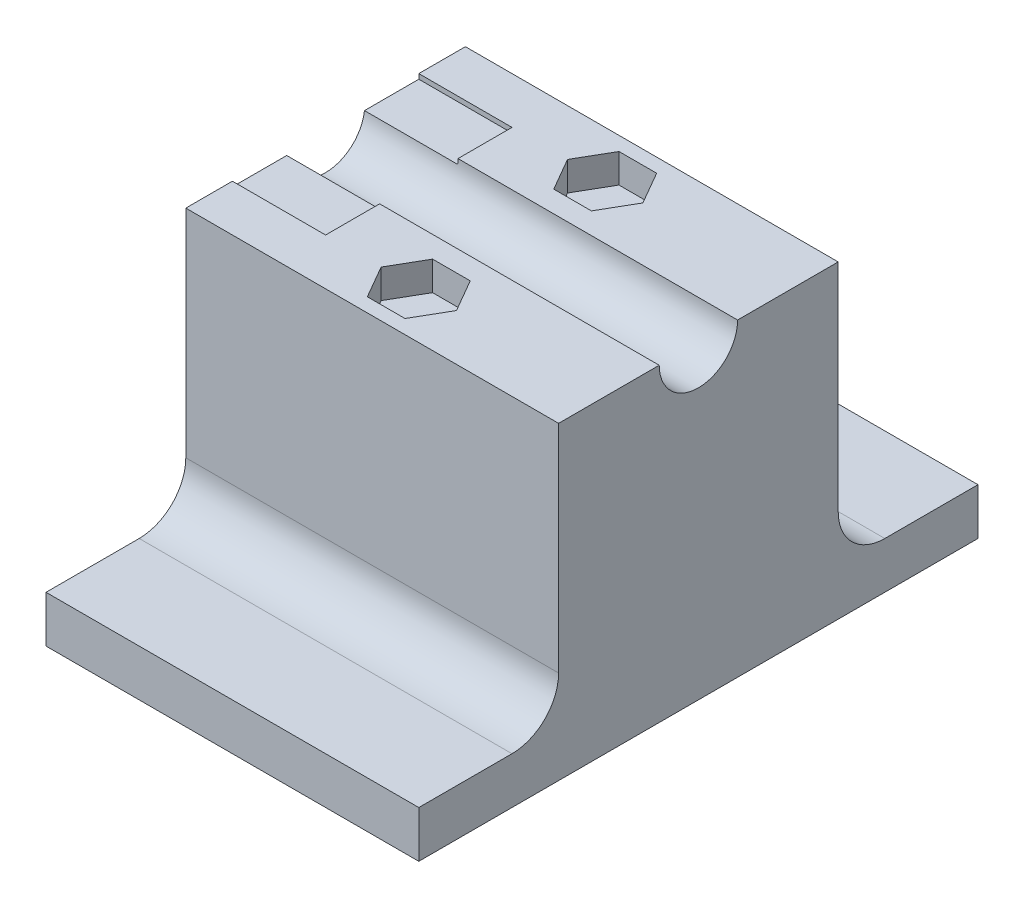
ISO-10303-21;
HEADER;
FILE_DESCRIPTION(('STEP AP214'),'2;1');
FILE_NAME('part.step','',(''),(''),'','','');
FILE_SCHEMA(('AUTOMOTIVE_DESIGN { 1 0 10303 214 1 1 1 1 }'));
ENDSEC;
DATA;
#1=APPLICATION_CONTEXT('core data for automotive mechanical design processes');
#2=APPLICATION_PROTOCOL_DEFINITION('international standard','automotive_design',2000,#1);
#3=PRODUCT_CONTEXT('',#1,'mechanical');
#4=PRODUCT('Part','Part','',(#3));
#5=PRODUCT_RELATED_PRODUCT_CATEGORY('part','',(#4));
#6=PRODUCT_DEFINITION_FORMATION('','',#4);
#7=PRODUCT_DEFINITION_CONTEXT('part definition',#1,'design');
#8=PRODUCT_DEFINITION('design','',#6,#7);
#9=PRODUCT_DEFINITION_SHAPE('','',#8);
#10=(LENGTH_UNIT() NAMED_UNIT(*) SI_UNIT(.MILLI.,.METRE.));
#11=(NAMED_UNIT(*) PLANE_ANGLE_UNIT() SI_UNIT($,.RADIAN.));
#12=(NAMED_UNIT(*) SI_UNIT($,.STERADIAN.) SOLID_ANGLE_UNIT());
#13=UNCERTAINTY_MEASURE_WITH_UNIT(LENGTH_MEASURE(1.E-05),#10,'distance_accuracy_value','');
#14=(GEOMETRIC_REPRESENTATION_CONTEXT(3) GLOBAL_UNCERTAINTY_ASSIGNED_CONTEXT((#13)) GLOBAL_UNIT_ASSIGNED_CONTEXT((#10,
#11,#12)) REPRESENTATION_CONTEXT('',''));
#15=CARTESIAN_POINT('',(0.,0.,0.));
#16=DIRECTION('',(0.,0.,1.));
#17=DIRECTION('',(1.,0.,0.));
#18=AXIS2_PLACEMENT_3D('',#15,#16,#17);
#19=CARTESIAN_POINT('',(0.,33.2,0.));
#20=DIRECTION('',(0.,-1.,0.));
#21=DIRECTION('',(0.,0.,-1.));
#22=AXIS2_PLACEMENT_3D('',#19,#20,#21);
#23=PLANE('',#22);
#24=DIRECTION('',(0.,0.,-1.));
#25=VECTOR('',#24,1.);
#26=CARTESIAN_POINT('',(-10.,33.2,0.));
#27=LINE('',#26,#25);
#28=CARTESIAN_POINT('',(-10.,33.2,9.99999999999993));
#29=VERTEX_POINT('',#28);
#30=CARTESIAN_POINT('',(-10.,33.2,4.205));
#31=VERTEX_POINT('',#30);
#32=EDGE_CURVE('E62',#29,#31,#27,.T.);
#33=ORIENTED_EDGE('',*,*,#32,.F.);
#34=DIRECTION('',(-1.,0.,0.));
#35=VECTOR('',#34,1.);
#36=CARTESIAN_POINT('',(0.,33.2,9.99999999999993));
#37=LINE('',#36,#35);
#38=CARTESIAN_POINT('',(-20.,33.2,9.99999999999993));
#39=VERTEX_POINT('',#38);
#40=EDGE_CURVE('E269',#29,#39,#37,.T.);
#41=ORIENTED_EDGE('',*,*,#40,.T.);
#42=DIRECTION('',(0.,0.,1.));
#43=VECTOR('',#42,1.);
#44=CARTESIAN_POINT('',(-20.,33.2,15.));
#45=LINE('',#44,#43);
#46=CARTESIAN_POINT('',(-20.,33.2,15.));
#47=VERTEX_POINT('',#46);
#48=EDGE_CURVE('E406',#39,#47,#45,.T.);
#49=ORIENTED_EDGE('',*,*,#48,.T.);
#50=DIRECTION('',(1.,0.,0.));
#51=VECTOR('',#50,1.);
#52=CARTESIAN_POINT('',(-20.,33.2,15.));
#53=LINE('',#52,#51);
#54=CARTESIAN_POINT('',(20.,33.2,15.));
#55=VERTEX_POINT('',#54);
#56=EDGE_CURVE('E405',#47,#55,#53,.T.);
#57=ORIENTED_EDGE('',*,*,#56,.T.);
#58=DIRECTION('',(0.,0.,-1.));
#59=VECTOR('',#58,1.);
#60=CARTESIAN_POINT('',(20.,33.2,15.));
#61=LINE('',#60,#59);
#62=CARTESIAN_POINT('',(20.,33.2,4.205));
#63=VERTEX_POINT('',#62);
#64=EDGE_CURVE('E409',#55,#63,#61,.T.);
#65=ORIENTED_EDGE('',*,*,#64,.T.);
#66=DIRECTION('',(-1.,0.,0.));
#67=VECTOR('',#66,1.);
#68=CARTESIAN_POINT('',(20.,33.2,4.205));
#69=LINE('',#68,#67);
#70=EDGE_CURVE('E431',#63,#31,#69,.T.);
#71=ORIENTED_EDGE('',*,*,#70,.T.);
#72=EDGE_LOOP('',(#33,#41,#49,#57,#65,#71));
#73=FACE_BOUND('',#72,.T.);
#74=DIRECTION('',(1.,0.,0.));
#75=VECTOR('',#74,1.);
#76=CARTESIAN_POINT('',(-2.02072594216369,33.2,6.5));
#77=LINE('',#76,#75);
#78=CARTESIAN_POINT('',(-2.02072594216369,33.2,6.5));
#79=VERTEX_POINT('',#78);
#80=CARTESIAN_POINT('',(2.02072594216369,33.2,6.5));
#81=VERTEX_POINT('',#80);
#82=EDGE_CURVE('E283',#79,#81,#77,.T.);
#83=ORIENTED_EDGE('',*,*,#82,.T.);
#84=DIRECTION('',(0.5,0.,0.866025403784439));
#85=VECTOR('',#84,1.);
#86=CARTESIAN_POINT('',(2.02072594216369,33.2,6.5));
#87=LINE('',#86,#85);
#88=CARTESIAN_POINT('',(4.04145188432738,33.2,10.));
#89=VERTEX_POINT('',#88);
#90=EDGE_CURVE('E307',#81,#89,#87,.T.);
#91=ORIENTED_EDGE('',*,*,#90,.T.);
#92=DIRECTION('',(-0.5,0.,0.866025403784439));
#93=VECTOR('',#92,1.);
#94=CARTESIAN_POINT('',(4.04145188432738,33.2,10.));
#95=LINE('',#94,#93);
#96=CARTESIAN_POINT('',(2.02072594216369,33.2,13.5));
#97=VERTEX_POINT('',#96);
#98=EDGE_CURVE('E329',#89,#97,#95,.T.);
#99=ORIENTED_EDGE('',*,*,#98,.T.);
#100=DIRECTION('',(-1.,0.,0.));
#101=VECTOR('',#100,1.);
#102=CARTESIAN_POINT('',(2.02072594216369,33.2,13.5));
#103=LINE('',#102,#101);
#104=CARTESIAN_POINT('',(-2.02072594216369,33.2,13.5));
#105=VERTEX_POINT('',#104);
#106=EDGE_CURVE('E326',#97,#105,#103,.T.);
#107=ORIENTED_EDGE('',*,*,#106,.T.);
#108=DIRECTION('',(-0.5,0.,-0.866025403784439));
#109=VECTOR('',#108,1.);
#110=CARTESIAN_POINT('',(-2.02072594216369,33.2,13.5));
#111=LINE('',#110,#109);
#112=CARTESIAN_POINT('',(-4.04145188432738,33.2,10.));
#113=VERTEX_POINT('',#112);
#114=EDGE_CURVE('E323',#105,#113,#111,.T.);
#115=ORIENTED_EDGE('',*,*,#114,.T.);
#116=DIRECTION('',(0.5,0.,-0.866025403784439));
#117=VECTOR('',#116,1.);
#118=CARTESIAN_POINT('',(-4.04145188432738,33.2,10.));
#119=LINE('',#118,#117);
#120=EDGE_CURVE('E320',#113,#79,#119,.T.);
#121=ORIENTED_EDGE('',*,*,#120,.T.);
#122=EDGE_LOOP('',(#83,#91,#99,#107,#115,#121));
#123=FACE_BOUND('',#122,.T.);
#124=ADVANCED_FACE('F39',(#73,#123),#23,.F.);
#125=CARTESIAN_POINT('',(-20.,33.2,15.));
#126=DIRECTION('',(1.,0.,0.));
#127=DIRECTION('',(0.,0.,-1.));
#128=AXIS2_PLACEMENT_3D('',#125,#126,#127);
#129=PLANE('',#128);
#130=ORIENTED_EDGE('',*,*,#48,.F.);
#131=DIRECTION('',(0.,1.,0.));
#132=VECTOR('',#131,1.);
#133=CARTESIAN_POINT('',(-20.,33.725,9.99999999999993));
#134=LINE('',#133,#132);
#135=CARTESIAN_POINT('',(-20.,32.675,9.99999999999993));
#136=VERTEX_POINT('',#135);
#137=EDGE_CURVE('E259',#136,#39,#134,.T.);
#138=ORIENTED_EDGE('',*,*,#137,.F.);
#139=DIRECTION('',(0.,0.,1.));
#140=VECTOR('',#139,1.);
#141=CARTESIAN_POINT('',(-20.,32.675,-10.0000000000001));
#142=LINE('',#141,#140);
#143=CARTESIAN_POINT('',(-20.,32.675,4.17209779367646));
#144=VERTEX_POINT('',#143);
#145=EDGE_CURVE('E262',#144,#136,#142,.T.);
#146=ORIENTED_EDGE('',*,*,#145,.F.);
#147=CARTESIAN_POINT('',(-20.,33.2,0.));
#148=DIRECTION('',(-1.,0.,0.));
#149=DIRECTION('',(0.,0.,1.));
#150=AXIS2_PLACEMENT_3D('',#147,#148,#149);
#151=CIRCLE('',#150,4.205);
#152=CARTESIAN_POINT('',(-20.,32.675,-4.17209779367646));
#153=VERTEX_POINT('',#152);
#154=EDGE_CURVE('E385',#153,#144,#151,.T.);
#155=ORIENTED_EDGE('',*,*,#154,.F.);
#156=CARTESIAN_POINT('',(-20.,32.675,-10.0000000000001));
#157=VERTEX_POINT('',#156);
#158=EDGE_CURVE('E263',#157,#153,#142,.T.);
#159=ORIENTED_EDGE('',*,*,#158,.F.);
#160=DIRECTION('',(0.,-1.,0.));
#161=VECTOR('',#160,1.);
#162=CARTESIAN_POINT('',(-20.,33.725,-10.0000000000001));
#163=LINE('',#162,#161);
#164=CARTESIAN_POINT('',(-20.,33.2,-10.0000000000001));
#165=VERTEX_POINT('',#164);
#166=EDGE_CURVE('E248',#165,#157,#163,.T.);
#167=ORIENTED_EDGE('',*,*,#166,.F.);
#168=CARTESIAN_POINT('',(-20.,33.2,-15.));
#169=VERTEX_POINT('',#168);
#170=EDGE_CURVE('E402',#169,#165,#45,.T.);
#171=ORIENTED_EDGE('',*,*,#170,.F.);
#172=DIRECTION('',(0.,-1.,0.));
#173=VECTOR('',#172,1.);
#174=CARTESIAN_POINT('',(-20.,33.2,-15.));
#175=LINE('',#174,#173);
#176=CARTESIAN_POINT('',(-20.,10.,-15.));
#177=VERTEX_POINT('',#176);
#178=EDGE_CURVE('E414',#169,#177,#175,.T.);
#179=ORIENTED_EDGE('',*,*,#178,.T.);
#180=CARTESIAN_POINT('',(-20.,10.,-20.));
#181=DIRECTION('',(1.,0.,0.));
#182=DIRECTION('',(0.,0.,-1.));
#183=AXIS2_PLACEMENT_3D('',#180,#181,#182);
#184=CIRCLE('',#183,5.);
#185=CARTESIAN_POINT('',(-20.,5.00000000000001,-20.));
#186=VERTEX_POINT('',#185);
#187=EDGE_CURVE('E444',#177,#186,#184,.T.);
#188=ORIENTED_EDGE('',*,*,#187,.T.);
#189=DIRECTION('',(0.,0.,-1.));
#190=VECTOR('',#189,1.);
#191=CARTESIAN_POINT('',(-20.,5.,30.));
#192=LINE('',#191,#190);
#193=CARTESIAN_POINT('',(-20.,5.00000000000001,-30.));
#194=VERTEX_POINT('',#193);
#195=EDGE_CURVE('E276',#186,#194,#192,.T.);
#196=ORIENTED_EDGE('',*,*,#195,.T.);
#197=DIRECTION('',(0.,-1.,0.));
#198=VECTOR('',#197,1.);
#199=CARTESIAN_POINT('',(-20.,0.,-30.));
#200=LINE('',#199,#198);
#201=CARTESIAN_POINT('',(-20.,0.,-30.));
#202=VERTEX_POINT('',#201);
#203=EDGE_CURVE('E273',#194,#202,#200,.T.);
#204=ORIENTED_EDGE('',*,*,#203,.T.);
#205=DIRECTION('',(0.,0.,1.));
#206=VECTOR('',#205,1.);
#207=CARTESIAN_POINT('',(-20.,0.,15.));
#208=LINE('',#207,#206);
#209=CARTESIAN_POINT('',(-20.,0.,30.));
#210=VERTEX_POINT('',#209);
#211=EDGE_CURVE('E399',#202,#210,#208,.T.);
#212=ORIENTED_EDGE('',*,*,#211,.T.);
#213=DIRECTION('',(0.,1.,0.));
#214=VECTOR('',#213,1.);
#215=CARTESIAN_POINT('',(-20.,0.,30.));
#216=LINE('',#215,#214);
#217=CARTESIAN_POINT('',(-20.,5.,30.));
#218=VERTEX_POINT('',#217);
#219=EDGE_CURVE('E281',#210,#218,#216,.T.);
#220=ORIENTED_EDGE('',*,*,#219,.T.);
#221=CARTESIAN_POINT('',(-20.,5.,20.));
#222=VERTEX_POINT('',#221);
#223=EDGE_CURVE('E278',#218,#222,#192,.T.);
#224=ORIENTED_EDGE('',*,*,#223,.T.);
#225=CARTESIAN_POINT('',(-20.,10.,20.));
#226=DIRECTION('',(1.,0.,0.));
#227=DIRECTION('',(0.,0.,-1.));
#228=AXIS2_PLACEMENT_3D('',#225,#226,#227);
#229=CIRCLE('',#228,5.);
#230=CARTESIAN_POINT('',(-20.,10.,15.));
#231=VERTEX_POINT('',#230);
#232=EDGE_CURVE('E450',#222,#231,#229,.T.);
#233=ORIENTED_EDGE('',*,*,#232,.T.);
#234=DIRECTION('',(0.,-1.,0.));
#235=VECTOR('',#234,1.);
#236=CARTESIAN_POINT('',(-20.,33.2,15.));
#237=LINE('',#236,#235);
#238=EDGE_CURVE('E426',#47,#231,#237,.T.);
#239=ORIENTED_EDGE('',*,*,#238,.F.);
#240=EDGE_LOOP('',(#130,#138,#146,#155,#159,#167,#171,#179,#188,#196,#204,#212,#220,#224,#233,#239));
#241=FACE_BOUND('',#240,.T.);
#242=ADVANCED_FACE('F477',(#241),#129,.F.);
#243=CARTESIAN_POINT('',(-20.,33.2,15.));
#244=DIRECTION('',(0.,0.,-1.));
#245=DIRECTION('',(-1.,0.,0.));
#246=AXIS2_PLACEMENT_3D('',#243,#244,#245);
#247=PLANE('',#246);
#248=ORIENTED_EDGE('',*,*,#238,.T.);
#249=DIRECTION('',(1.,0.,0.));
#250=VECTOR('',#249,1.);
#251=CARTESIAN_POINT('',(-20.,10.,15.));
#252=LINE('',#251,#250);
#253=CARTESIAN_POINT('',(20.,10.,15.));
#254=VERTEX_POINT('',#253);
#255=EDGE_CURVE('E439',#231,#254,#252,.T.);
#256=ORIENTED_EDGE('',*,*,#255,.T.);
#257=DIRECTION('',(0.,-1.,0.));
#258=VECTOR('',#257,1.);
#259=CARTESIAN_POINT('',(20.,33.2,15.));
#260=LINE('',#259,#258);
#261=EDGE_CURVE('E423',#55,#254,#260,.T.);
#262=ORIENTED_EDGE('',*,*,#261,.F.);
#263=ORIENTED_EDGE('',*,*,#56,.F.);
#264=EDGE_LOOP('',(#248,#256,#262,#263));
#265=FACE_BOUND('',#264,.T.);
#266=ADVANCED_FACE('F493',(#265),#247,.F.);
#267=CARTESIAN_POINT('',(20.,33.2,15.));
#268=DIRECTION('',(-1.,0.,0.));
#269=DIRECTION('',(0.,0.,1.));
#270=AXIS2_PLACEMENT_3D('',#267,#268,#269);
#271=PLANE('',#270);
#272=ORIENTED_EDGE('',*,*,#261,.T.);
#273=CARTESIAN_POINT('',(20.,10.,20.));
#274=DIRECTION('',(-1.,0.,0.));
#275=DIRECTION('',(0.,0.,1.));
#276=AXIS2_PLACEMENT_3D('',#273,#274,#275);
#277=CIRCLE('',#276,5.);
#278=CARTESIAN_POINT('',(20.,5.,20.));
#279=VERTEX_POINT('',#278);
#280=EDGE_CURVE('E448',#254,#279,#277,.T.);
#281=ORIENTED_EDGE('',*,*,#280,.T.);
#282=DIRECTION('',(0.,0.,1.));
#283=VECTOR('',#282,1.);
#284=CARTESIAN_POINT('',(20.,5.,30.));
#285=LINE('',#284,#283);
#286=CARTESIAN_POINT('',(20.,5.,30.));
#287=VERTEX_POINT('',#286);
#288=EDGE_CURVE('E289',#279,#287,#285,.T.);
#289=ORIENTED_EDGE('',*,*,#288,.T.);
#290=DIRECTION('',(0.,-1.,0.));
#291=VECTOR('',#290,1.);
#292=CARTESIAN_POINT('',(20.,0.,30.));
#293=LINE('',#292,#291);
#294=CARTESIAN_POINT('',(20.,0.,30.));
#295=VERTEX_POINT('',#294);
#296=EDGE_CURVE('E272',#287,#295,#293,.T.);
#297=ORIENTED_EDGE('',*,*,#296,.T.);
#298=DIRECTION('',(0.,0.,-1.));
#299=VECTOR('',#298,1.);
#300=CARTESIAN_POINT('',(20.,0.,15.));
#301=LINE('',#300,#299);
#302=CARTESIAN_POINT('',(20.,0.,-30.));
#303=VERTEX_POINT('',#302);
#304=EDGE_CURVE('E416',#295,#303,#301,.T.);
#305=ORIENTED_EDGE('',*,*,#304,.T.);
#306=DIRECTION('',(0.,1.,0.));
#307=VECTOR('',#306,1.);
#308=CARTESIAN_POINT('',(20.,0.,-30.));
#309=LINE('',#308,#307);
#310=CARTESIAN_POINT('',(20.,5.00000000000001,-30.));
#311=VERTEX_POINT('',#310);
#312=EDGE_CURVE('E286',#303,#311,#309,.T.);
#313=ORIENTED_EDGE('',*,*,#312,.T.);
#314=CARTESIAN_POINT('',(20.,5.00000000000001,-20.));
#315=VERTEX_POINT('',#314);
#316=EDGE_CURVE('E290',#311,#315,#285,.T.);
#317=ORIENTED_EDGE('',*,*,#316,.T.);
#318=CARTESIAN_POINT('',(20.,10.,-20.));
#319=DIRECTION('',(-1.,0.,0.));
#320=DIRECTION('',(0.,0.,1.));
#321=AXIS2_PLACEMENT_3D('',#318,#319,#320);
#322=CIRCLE('',#321,5.);
#323=CARTESIAN_POINT('',(20.,10.,-15.));
#324=VERTEX_POINT('',#323);
#325=EDGE_CURVE('E446',#315,#324,#322,.T.);
#326=ORIENTED_EDGE('',*,*,#325,.T.);
#327=DIRECTION('',(0.,-1.,0.));
#328=VECTOR('',#327,1.);
#329=CARTESIAN_POINT('',(20.,33.2,-15.));
#330=LINE('',#329,#328);
#331=CARTESIAN_POINT('',(20.,33.2,-15.));
#332=VERTEX_POINT('',#331);
#333=EDGE_CURVE('E420',#332,#324,#330,.T.);
#334=ORIENTED_EDGE('',*,*,#333,.F.);
#335=CARTESIAN_POINT('',(20.,33.2,-4.205));
#336=VERTEX_POINT('',#335);
#337=EDGE_CURVE('E408',#336,#332,#61,.T.);
#338=ORIENTED_EDGE('',*,*,#337,.F.);
#339=CARTESIAN_POINT('',(20.,33.2,0.));
#340=DIRECTION('',(-1.,0.,0.));
#341=DIRECTION('',(0.,0.,1.));
#342=AXIS2_PLACEMENT_3D('',#339,#340,#341);
#343=CIRCLE('',#342,4.205);
#344=EDGE_CURVE('E396',#336,#63,#343,.T.);
#345=ORIENTED_EDGE('',*,*,#344,.T.);
#346=ORIENTED_EDGE('',*,*,#64,.F.);
#347=EDGE_LOOP('',(#272,#281,#289,#297,#305,#313,#317,#326,#334,#338,#345,#346));
#348=FACE_BOUND('',#347,.T.);
#349=ADVANCED_FACE('F468',(#348),#271,.F.);
#350=CARTESIAN_POINT('',(-20.,33.2,-15.));
#351=DIRECTION('',(0.,0.,1.));
#352=DIRECTION('',(1.,0.,0.));
#353=AXIS2_PLACEMENT_3D('',#350,#351,#352);
#354=PLANE('',#353);
#355=ORIENTED_EDGE('',*,*,#333,.T.);
#356=DIRECTION('',(-1.,0.,0.));
#357=VECTOR('',#356,1.);
#358=CARTESIAN_POINT('',(-20.,10.,-15.));
#359=LINE('',#358,#357);
#360=EDGE_CURVE('E434',#324,#177,#359,.T.);
#361=ORIENTED_EDGE('',*,*,#360,.T.);
#362=ORIENTED_EDGE('',*,*,#178,.F.);
#363=DIRECTION('',(-1.,0.,0.));
#364=VECTOR('',#363,1.);
#365=CARTESIAN_POINT('',(-20.,33.2,-15.));
#366=LINE('',#365,#364);
#367=EDGE_CURVE('E412',#332,#169,#366,.T.);
#368=ORIENTED_EDGE('',*,*,#367,.F.);
#369=EDGE_LOOP('',(#355,#361,#362,#368));
#370=FACE_BOUND('',#369,.T.);
#371=ADVANCED_FACE('F473',(#370),#354,.F.);
#372=DIRECTION('',(0.5,0.,-0.866025403784439));
#373=VECTOR('',#372,1.);
#374=CARTESIAN_POINT('',(2.02072594216369,33.2,-6.5));
#375=LINE('',#374,#373);
#376=CARTESIAN_POINT('',(2.02072594216369,33.2,-6.5));
#377=VERTEX_POINT('',#376);
#378=CARTESIAN_POINT('',(4.04145188432738,33.2,-10.));
#379=VERTEX_POINT('',#378);
#380=EDGE_CURVE('E369',#377,#379,#375,.T.);
#381=ORIENTED_EDGE('',*,*,#380,.F.);
#382=DIRECTION('',(1.,0.,0.));
#383=VECTOR('',#382,1.);
#384=CARTESIAN_POINT('',(-2.02072594216369,33.2,-6.5));
#385=LINE('',#384,#383);
#386=CARTESIAN_POINT('',(-2.02072594216369,33.2,-6.5));
#387=VERTEX_POINT('',#386);
#388=EDGE_CURVE('E337',#387,#377,#385,.T.);
#389=ORIENTED_EDGE('',*,*,#388,.F.);
#390=DIRECTION('',(0.5,0.,0.866025403784439));
#391=VECTOR('',#390,1.);
#392=CARTESIAN_POINT('',(-4.04145188432738,33.2,-10.));
#393=LINE('',#392,#391);
#394=CARTESIAN_POINT('',(-4.04145188432738,33.2,-10.));
#395=VERTEX_POINT('',#394);
#396=EDGE_CURVE('E352',#395,#387,#393,.T.);
#397=ORIENTED_EDGE('',*,*,#396,.F.);
#398=DIRECTION('',(-0.5,0.,0.866025403784439));
#399=VECTOR('',#398,1.);
#400=CARTESIAN_POINT('',(-2.02072594216369,33.2,-13.5));
#401=LINE('',#400,#399);
#402=CARTESIAN_POINT('',(-2.02072594216369,33.2,-13.5));
#403=VERTEX_POINT('',#402);
#404=EDGE_CURVE('E378',#403,#395,#401,.T.);
#405=ORIENTED_EDGE('',*,*,#404,.F.);
#406=DIRECTION('',(-1.,0.,0.));
#407=VECTOR('',#406,1.);
#408=CARTESIAN_POINT('',(2.02072594216369,33.2,-13.5));
#409=LINE('',#408,#407);
#410=CARTESIAN_POINT('',(2.02072594216369,33.2,-13.5));
#411=VERTEX_POINT('',#410);
#412=EDGE_CURVE('E375',#411,#403,#409,.T.);
#413=ORIENTED_EDGE('',*,*,#412,.F.);
#414=DIRECTION('',(-0.5,0.,-0.866025403784439));
#415=VECTOR('',#414,1.);
#416=CARTESIAN_POINT('',(4.04145188432738,33.2,-10.));
#417=LINE('',#416,#415);
#418=EDGE_CURVE('E372',#379,#411,#417,.T.);
#419=ORIENTED_EDGE('',*,*,#418,.F.);
#420=EDGE_LOOP('',(#381,#389,#397,#405,#413,#419));
#421=FACE_BOUND('',#420,.T.);
#422=ORIENTED_EDGE('',*,*,#170,.T.);
#423=DIRECTION('',(1.,0.,0.));
#424=VECTOR('',#423,1.);
#425=CARTESIAN_POINT('',(0.,33.2,-10.0000000000001));
#426=LINE('',#425,#424);
#427=CARTESIAN_POINT('',(-10.,33.2,-10.0000000000001));
#428=VERTEX_POINT('',#427);
#429=EDGE_CURVE('E11',#165,#428,#426,.T.);
#430=ORIENTED_EDGE('',*,*,#429,.T.);
#431=DIRECTION('',(0.,0.,-1.));
#432=VECTOR('',#431,1.);
#433=CARTESIAN_POINT('',(-10.,33.2,0.));
#434=LINE('',#433,#432);
#435=CARTESIAN_POINT('',(-10.,33.2,-4.205));
#436=VERTEX_POINT('',#435);
#437=EDGE_CURVE('E239',#436,#428,#434,.T.);
#438=ORIENTED_EDGE('',*,*,#437,.F.);
#439=DIRECTION('',(-1.,0.,0.));
#440=VECTOR('',#439,1.);
#441=CARTESIAN_POINT('',(20.,33.2,-4.205));
#442=LINE('',#441,#440);
#443=EDGE_CURVE('E429',#436,#336,#442,.F.);
#444=ORIENTED_EDGE('',*,*,#443,.T.);
#445=ORIENTED_EDGE('',*,*,#337,.T.);
#446=ORIENTED_EDGE('',*,*,#367,.T.);
#447=EDGE_LOOP('',(#422,#430,#438,#444,#445,#446));
#448=FACE_BOUND('',#447,.T.);
#449=ADVANCED_FACE('F461',(#421,#448),#23,.F.);
#450=CARTESIAN_POINT('',(0.,0.,0.));
#451=DIRECTION('',(0.,-1.,0.));
#452=DIRECTION('',(0.,0.,-1.));
#453=AXIS2_PLACEMENT_3D('',#450,#451,#452);
#454=PLANE('',#453);
#455=ORIENTED_EDGE('',*,*,#211,.F.);
#456=DIRECTION('',(1.,0.,0.));
#457=VECTOR('',#456,1.);
#458=CARTESIAN_POINT('',(-80.2079728939615,0.,-30.));
#459=LINE('',#458,#457);
#460=EDGE_CURVE('E298',#202,#303,#459,.T.);
#461=ORIENTED_EDGE('',*,*,#460,.T.);
#462=ORIENTED_EDGE('',*,*,#304,.F.);
#463=DIRECTION('',(1.,0.,0.));
#464=VECTOR('',#463,1.);
#465=CARTESIAN_POINT('',(-80.2079728939615,0.,30.));
#466=LINE('',#465,#464);
#467=EDGE_CURVE('E293',#210,#295,#466,.T.);
#468=ORIENTED_EDGE('',*,*,#467,.F.);
#469=EDGE_LOOP('',(#455,#461,#462,#468));
#470=FACE_BOUND('',#469,.T.);
#471=ADVANCED_FACE('F509',(#470),#454,.T.);
#472=CARTESIAN_POINT('',(20.,33.2,0.));
#473=DIRECTION('',(-1.,0.,0.));
#474=DIRECTION('',(0.,0.,1.));
#475=AXIS2_PLACEMENT_3D('',#472,#473,#474);
#476=CYLINDRICAL_SURFACE('',#475,4.205);
#477=CARTESIAN_POINT('',(-10.,33.2,0.));
#478=DIRECTION('',(-1.,0.,0.));
#479=DIRECTION('',(0.,0.,1.));
#480=AXIS2_PLACEMENT_3D('',#477,#478,#479);
#481=CIRCLE('',#480,4.205);
#482=CARTESIAN_POINT('',(-10.,32.675,-4.17209779367646));
#483=VERTEX_POINT('',#482);
#484=EDGE_CURVE('E455',#483,#436,#481,.F.);
#485=ORIENTED_EDGE('',*,*,#484,.F.);
#486=DIRECTION('',(-1.,0.,0.));
#487=VECTOR('',#486,1.);
#488=CARTESIAN_POINT('',(20.,32.675,-4.17209779367646));
#489=LINE('',#488,#487);
#490=EDGE_CURVE('E47',#483,#153,#489,.T.);
#491=ORIENTED_EDGE('',*,*,#490,.T.);
#492=ORIENTED_EDGE('',*,*,#154,.T.);
#493=DIRECTION('',(-1.,0.,0.));
#494=VECTOR('',#493,1.);
#495=CARTESIAN_POINT('',(20.,32.675,4.17209779367646));
#496=LINE('',#495,#494);
#497=CARTESIAN_POINT('',(-10.,32.675,4.17209779367646));
#498=VERTEX_POINT('',#497);
#499=EDGE_CURVE('E454',#144,#498,#496,.F.);
#500=ORIENTED_EDGE('',*,*,#499,.T.);
#501=EDGE_CURVE('E452',#31,#498,#481,.F.);
#502=ORIENTED_EDGE('',*,*,#501,.F.);
#503=ORIENTED_EDGE('',*,*,#70,.F.);
#504=ORIENTED_EDGE('',*,*,#344,.F.);
#505=ORIENTED_EDGE('',*,*,#443,.F.);
#506=EDGE_LOOP('',(#485,#491,#492,#500,#502,#503,#504,#505));
#507=FACE_BOUND('',#506,.T.);
#508=ADVANCED_FACE('F463',(#507),#476,.F.);
#509=CARTESIAN_POINT('',(-2.02072594216369,30.08,-6.5));
#510=DIRECTION('',(0.,0.,1.));
#511=DIRECTION('',(1.,0.,0.));
#512=AXIS2_PLACEMENT_3D('',#509,#510,#511);
#513=PLANE('',#512);
#514=ORIENTED_EDGE('',*,*,#388,.T.);
#515=DIRECTION('',(0.,1.,0.));
#516=VECTOR('',#515,1.);
#517=CARTESIAN_POINT('',(2.02072594216369,30.08,-6.5));
#518=LINE('',#517,#516);
#519=CARTESIAN_POINT('',(2.02072594216369,30.08,-6.5));
#520=VERTEX_POINT('',#519);
#521=EDGE_CURVE('E367',#520,#377,#518,.T.);
#522=ORIENTED_EDGE('',*,*,#521,.F.);
#523=DIRECTION('',(1.,0.,0.));
#524=VECTOR('',#523,1.);
#525=CARTESIAN_POINT('',(-2.02072594216369,30.08,-6.5));
#526=LINE('',#525,#524);
#527=CARTESIAN_POINT('',(-2.02072594216369,30.08,-6.5));
#528=VERTEX_POINT('',#527);
#529=EDGE_CURVE('E348',#528,#520,#526,.T.);
#530=ORIENTED_EDGE('',*,*,#529,.F.);
#531=DIRECTION('',(0.,1.,0.));
#532=VECTOR('',#531,1.);
#533=CARTESIAN_POINT('',(-2.02072594216369,30.08,-6.5));
#534=LINE('',#533,#532);
#535=EDGE_CURVE('E383',#528,#387,#534,.T.);
#536=ORIENTED_EDGE('',*,*,#535,.T.);
#537=EDGE_LOOP('',(#514,#522,#530,#536));
#538=FACE_BOUND('',#537,.T.);
#539=ADVANCED_FACE('F565',(#538),#513,.F.);
#540=CARTESIAN_POINT('',(-4.04145188432738,30.08,-10.));
#541=DIRECTION('',(-0.866025403784439,0.,0.5));
#542=DIRECTION('',(0.5,0.,0.866025403784439));
#543=AXIS2_PLACEMENT_3D('',#540,#541,#542);
#544=PLANE('',#543);
#545=ORIENTED_EDGE('',*,*,#396,.T.);
#546=ORIENTED_EDGE('',*,*,#535,.F.);
#547=DIRECTION('',(0.5,0.,0.866025403784439));
#548=VECTOR('',#547,1.);
#549=CARTESIAN_POINT('',(-4.04145188432738,30.08,-10.));
#550=LINE('',#549,#548);
#551=CARTESIAN_POINT('',(-4.04145188432738,30.08,-10.));
#552=VERTEX_POINT('',#551);
#553=EDGE_CURVE('E364',#552,#528,#550,.T.);
#554=ORIENTED_EDGE('',*,*,#553,.F.);
#555=DIRECTION('',(0.,1.,0.));
#556=VECTOR('',#555,1.);
#557=CARTESIAN_POINT('',(-4.04145188432738,30.08,-10.));
#558=LINE('',#557,#556);
#559=EDGE_CURVE('E386',#552,#395,#558,.T.);
#560=ORIENTED_EDGE('',*,*,#559,.T.);
#561=EDGE_LOOP('',(#545,#546,#554,#560));
#562=FACE_BOUND('',#561,.T.);
#563=ADVANCED_FACE('F568',(#562),#544,.F.);
#564=CARTESIAN_POINT('',(-2.02072594216369,30.08,-13.5));
#565=DIRECTION('',(-0.866025403784439,0.,-0.5));
#566=DIRECTION('',(-0.5,0.,0.866025403784439));
#567=AXIS2_PLACEMENT_3D('',#564,#565,#566);
#568=PLANE('',#567);
#569=ORIENTED_EDGE('',*,*,#404,.T.);
#570=ORIENTED_EDGE('',*,*,#559,.F.);
#571=DIRECTION('',(-0.5,0.,0.866025403784439));
#572=VECTOR('',#571,1.);
#573=CARTESIAN_POINT('',(-2.02072594216369,30.08,-13.5));
#574=LINE('',#573,#572);
#575=CARTESIAN_POINT('',(-2.02072594216369,30.08,-13.5));
#576=VERTEX_POINT('',#575);
#577=EDGE_CURVE('E361',#576,#552,#574,.T.);
#578=ORIENTED_EDGE('',*,*,#577,.F.);
#579=DIRECTION('',(0.,1.,0.));
#580=VECTOR('',#579,1.);
#581=CARTESIAN_POINT('',(-2.02072594216369,30.08,-13.5));
#582=LINE('',#581,#580);
#583=EDGE_CURVE('E388',#576,#403,#582,.T.);
#584=ORIENTED_EDGE('',*,*,#583,.T.);
#585=EDGE_LOOP('',(#569,#570,#578,#584));
#586=FACE_BOUND('',#585,.T.);
#587=ADVANCED_FACE('F571',(#586),#568,.F.);
#588=CARTESIAN_POINT('',(2.02072594216369,30.08,-13.5));
#589=DIRECTION('',(0.,0.,-1.));
#590=DIRECTION('',(-1.,0.,0.));
#591=AXIS2_PLACEMENT_3D('',#588,#589,#590);
#592=PLANE('',#591);
#593=ORIENTED_EDGE('',*,*,#412,.T.);
#594=ORIENTED_EDGE('',*,*,#583,.F.);
#595=DIRECTION('',(-1.,0.,0.));
#596=VECTOR('',#595,1.);
#597=CARTESIAN_POINT('',(2.02072594216369,30.08,-13.5));
#598=LINE('',#597,#596);
#599=CARTESIAN_POINT('',(2.02072594216369,30.08,-13.5));
#600=VERTEX_POINT('',#599);
#601=EDGE_CURVE('E358',#600,#576,#598,.T.);
#602=ORIENTED_EDGE('',*,*,#601,.F.);
#603=DIRECTION('',(0.,1.,0.));
#604=VECTOR('',#603,1.);
#605=CARTESIAN_POINT('',(2.02072594216369,30.08,-13.5));
#606=LINE('',#605,#604);
#607=EDGE_CURVE('E390',#600,#411,#606,.T.);
#608=ORIENTED_EDGE('',*,*,#607,.T.);
#609=EDGE_LOOP('',(#593,#594,#602,#608));
#610=FACE_BOUND('',#609,.T.);
#611=ADVANCED_FACE('F575',(#610),#592,.F.);
#612=CARTESIAN_POINT('',(4.04145188432738,30.08,-10.));
#613=DIRECTION('',(0.866025403784439,0.,-0.5));
#614=DIRECTION('',(-0.5,0.,-0.866025403784439));
#615=AXIS2_PLACEMENT_3D('',#612,#613,#614);
#616=PLANE('',#615);
#617=ORIENTED_EDGE('',*,*,#418,.T.);
#618=ORIENTED_EDGE('',*,*,#607,.F.);
#619=DIRECTION('',(-0.5,0.,-0.866025403784439));
#620=VECTOR('',#619,1.);
#621=CARTESIAN_POINT('',(4.04145188432738,30.08,-10.));
#622=LINE('',#621,#620);
#623=CARTESIAN_POINT('',(4.04145188432738,30.08,-10.));
#624=VERTEX_POINT('',#623);
#625=EDGE_CURVE('E355',#624,#600,#622,.T.);
#626=ORIENTED_EDGE('',*,*,#625,.F.);
#627=DIRECTION('',(0.,1.,0.));
#628=VECTOR('',#627,1.);
#629=CARTESIAN_POINT('',(4.04145188432738,30.08,-10.));
#630=LINE('',#629,#628);
#631=EDGE_CURVE('E392',#624,#379,#630,.T.);
#632=ORIENTED_EDGE('',*,*,#631,.T.);
#633=EDGE_LOOP('',(#617,#618,#626,#632));
#634=FACE_BOUND('',#633,.T.);
#635=ADVANCED_FACE('F577',(#634),#616,.F.);
#636=CARTESIAN_POINT('',(2.02072594216369,30.08,-6.5));
#637=DIRECTION('',(0.866025403784439,0.,0.5));
#638=DIRECTION('',(0.5,0.,-0.866025403784439));
#639=AXIS2_PLACEMENT_3D('',#636,#637,#638);
#640=PLANE('',#639);
#641=ORIENTED_EDGE('',*,*,#380,.T.);
#642=ORIENTED_EDGE('',*,*,#631,.F.);
#643=DIRECTION('',(0.5,0.,-0.866025403784439));
#644=VECTOR('',#643,1.);
#645=CARTESIAN_POINT('',(2.02072594216369,30.08,-6.5));
#646=LINE('',#645,#644);
#647=EDGE_CURVE('E351',#520,#624,#646,.T.);
#648=ORIENTED_EDGE('',*,*,#647,.F.);
#649=ORIENTED_EDGE('',*,*,#521,.T.);
#650=EDGE_LOOP('',(#641,#642,#648,#649));
#651=FACE_BOUND('',#650,.T.);
#652=ADVANCED_FACE('F560',(#651),#640,.F.);
#653=CARTESIAN_POINT('',(0.,30.08,0.));
#654=DIRECTION('',(0.,1.,0.));
#655=DIRECTION('',(0.,0.,1.));
#656=AXIS2_PLACEMENT_3D('',#653,#654,#655);
#657=PLANE('',#656);
#658=ORIENTED_EDGE('',*,*,#529,.T.);
#659=ORIENTED_EDGE('',*,*,#647,.T.);
#660=ORIENTED_EDGE('',*,*,#625,.T.);
#661=ORIENTED_EDGE('',*,*,#601,.T.);
#662=ORIENTED_EDGE('',*,*,#577,.T.);
#663=ORIENTED_EDGE('',*,*,#553,.T.);
#664=EDGE_LOOP('',(#658,#659,#660,#661,#662,#663));
#665=FACE_BOUND('',#664,.T.);
#666=ADVANCED_FACE('F579',(#665),#657,.T.);
#667=CARTESIAN_POINT('',(-2.02072594216369,30.08,6.5));
#668=DIRECTION('',(0.,0.,1.));
#669=DIRECTION('',(1.,0.,0.));
#670=AXIS2_PLACEMENT_3D('',#667,#668,#669);
#671=PLANE('',#670);
#672=ORIENTED_EDGE('',*,*,#82,.F.);
#673=DIRECTION('',(0.,1.,0.));
#674=VECTOR('',#673,1.);
#675=CARTESIAN_POINT('',(-2.02072594216369,30.08,6.5));
#676=LINE('',#675,#674);
#677=CARTESIAN_POINT('',(-2.02072594216369,30.08,6.5));
#678=VERTEX_POINT('',#677);
#679=EDGE_CURVE('E317',#678,#79,#676,.T.);
#680=ORIENTED_EDGE('',*,*,#679,.F.);
#681=DIRECTION('',(1.,0.,0.));
#682=VECTOR('',#681,1.);
#683=CARTESIAN_POINT('',(-2.02072594216369,30.08,6.5));
#684=LINE('',#683,#682);
#685=CARTESIAN_POINT('',(2.02072594216369,30.08,6.5));
#686=VERTEX_POINT('',#685);
#687=EDGE_CURVE('E303',#678,#686,#684,.T.);
#688=ORIENTED_EDGE('',*,*,#687,.T.);
#689=DIRECTION('',(0.,1.,0.));
#690=VECTOR('',#689,1.);
#691=CARTESIAN_POINT('',(2.02072594216369,30.08,6.5));
#692=LINE('',#691,#690);
#693=EDGE_CURVE('E334',#686,#81,#692,.T.);
#694=ORIENTED_EDGE('',*,*,#693,.T.);
#695=EDGE_LOOP('',(#672,#680,#688,#694));
#696=FACE_BOUND('',#695,.T.);
#697=ADVANCED_FACE('F581',(#696),#671,.T.);
#698=CARTESIAN_POINT('',(2.02072594216369,30.08,6.5));
#699=DIRECTION('',(-0.866025403784439,0.,0.5));
#700=DIRECTION('',(0.5,0.,0.866025403784439));
#701=AXIS2_PLACEMENT_3D('',#698,#699,#700);
#702=PLANE('',#701);
#703=ORIENTED_EDGE('',*,*,#90,.F.);
#704=ORIENTED_EDGE('',*,*,#693,.F.);
#705=DIRECTION('',(0.5,0.,0.866025403784439));
#706=VECTOR('',#705,1.);
#707=CARTESIAN_POINT('',(2.02072594216369,30.08,6.5));
#708=LINE('',#707,#706);
#709=CARTESIAN_POINT('',(4.04145188432738,30.08,10.));
#710=VERTEX_POINT('',#709);
#711=EDGE_CURVE('E315',#686,#710,#708,.T.);
#712=ORIENTED_EDGE('',*,*,#711,.T.);
#713=DIRECTION('',(0.,1.,0.));
#714=VECTOR('',#713,1.);
#715=CARTESIAN_POINT('',(4.04145188432738,30.08,10.));
#716=LINE('',#715,#714);
#717=EDGE_CURVE('E338',#710,#89,#716,.T.);
#718=ORIENTED_EDGE('',*,*,#717,.T.);
#719=EDGE_LOOP('',(#703,#704,#712,#718));
#720=FACE_BOUND('',#719,.T.);
#721=ADVANCED_FACE('F587',(#720),#702,.T.);
#722=CARTESIAN_POINT('',(4.04145188432738,30.08,10.));
#723=DIRECTION('',(-0.866025403784439,0.,-0.5));
#724=DIRECTION('',(-0.5,0.,0.866025403784439));
#725=AXIS2_PLACEMENT_3D('',#722,#723,#724);
#726=PLANE('',#725);
#727=ORIENTED_EDGE('',*,*,#98,.F.);
#728=ORIENTED_EDGE('',*,*,#717,.F.);
#729=DIRECTION('',(-0.5,0.,0.866025403784439));
#730=VECTOR('',#729,1.);
#731=CARTESIAN_POINT('',(4.04145188432738,30.08,10.));
#732=LINE('',#731,#730);
#733=CARTESIAN_POINT('',(2.02072594216369,30.08,13.5));
#734=VERTEX_POINT('',#733);
#735=EDGE_CURVE('E313',#710,#734,#732,.T.);
#736=ORIENTED_EDGE('',*,*,#735,.T.);
#737=DIRECTION('',(0.,1.,0.));
#738=VECTOR('',#737,1.);
#739=CARTESIAN_POINT('',(2.02072594216369,30.08,13.5));
#740=LINE('',#739,#738);
#741=EDGE_CURVE('E340',#734,#97,#740,.T.);
#742=ORIENTED_EDGE('',*,*,#741,.T.);
#743=EDGE_LOOP('',(#727,#728,#736,#742));
#744=FACE_BOUND('',#743,.T.);
#745=ADVANCED_FACE('F716',(#744),#726,.T.);
#746=CARTESIAN_POINT('',(2.02072594216369,30.08,13.5));
#747=DIRECTION('',(0.,0.,-1.));
#748=DIRECTION('',(-1.,0.,0.));
#749=AXIS2_PLACEMENT_3D('',#746,#747,#748);
#750=PLANE('',#749);
#751=ORIENTED_EDGE('',*,*,#106,.F.);
#752=ORIENTED_EDGE('',*,*,#741,.F.);
#753=DIRECTION('',(-1.,0.,0.));
#754=VECTOR('',#753,1.);
#755=CARTESIAN_POINT('',(2.02072594216369,30.08,13.5));
#756=LINE('',#755,#754);
#757=CARTESIAN_POINT('',(-2.02072594216369,30.08,13.5));
#758=VERTEX_POINT('',#757);
#759=EDGE_CURVE('E311',#734,#758,#756,.T.);
#760=ORIENTED_EDGE('',*,*,#759,.T.);
#761=DIRECTION('',(0.,1.,0.));
#762=VECTOR('',#761,1.);
#763=CARTESIAN_POINT('',(-2.02072594216369,30.08,13.5));
#764=LINE('',#763,#762);
#765=EDGE_CURVE('E342',#758,#105,#764,.T.);
#766=ORIENTED_EDGE('',*,*,#765,.T.);
#767=EDGE_LOOP('',(#751,#752,#760,#766));
#768=FACE_BOUND('',#767,.T.);
#769=ADVANCED_FACE('F707',(#768),#750,.T.);
#770=CARTESIAN_POINT('',(-2.02072594216369,30.08,13.5));
#771=DIRECTION('',(0.866025403784439,0.,-0.5));
#772=DIRECTION('',(-0.5,0.,-0.866025403784439));
#773=AXIS2_PLACEMENT_3D('',#770,#771,#772);
#774=PLANE('',#773);
#775=ORIENTED_EDGE('',*,*,#114,.F.);
#776=ORIENTED_EDGE('',*,*,#765,.F.);
#777=DIRECTION('',(-0.5,0.,-0.866025403784439));
#778=VECTOR('',#777,1.);
#779=CARTESIAN_POINT('',(-2.02072594216369,30.08,13.5));
#780=LINE('',#779,#778);
#781=CARTESIAN_POINT('',(-4.04145188432738,30.08,10.));
#782=VERTEX_POINT('',#781);
#783=EDGE_CURVE('E309',#758,#782,#780,.T.);
#784=ORIENTED_EDGE('',*,*,#783,.T.);
#785=DIRECTION('',(0.,1.,0.));
#786=VECTOR('',#785,1.);
#787=CARTESIAN_POINT('',(-4.04145188432738,30.08,10.));
#788=LINE('',#787,#786);
#789=EDGE_CURVE('E344',#782,#113,#788,.T.);
#790=ORIENTED_EDGE('',*,*,#789,.T.);
#791=EDGE_LOOP('',(#775,#776,#784,#790));
#792=FACE_BOUND('',#791,.T.);
#793=ADVANCED_FACE('F699',(#792),#774,.T.);
#794=CARTESIAN_POINT('',(-4.04145188432738,30.08,10.));
#795=DIRECTION('',(0.866025403784439,0.,0.5));
#796=DIRECTION('',(0.5,0.,-0.866025403784439));
#797=AXIS2_PLACEMENT_3D('',#794,#795,#796);
#798=PLANE('',#797);
#799=ORIENTED_EDGE('',*,*,#120,.F.);
#800=ORIENTED_EDGE('',*,*,#789,.F.);
#801=DIRECTION('',(0.5,0.,-0.866025403784439));
#802=VECTOR('',#801,1.);
#803=CARTESIAN_POINT('',(-4.04145188432738,30.08,10.));
#804=LINE('',#803,#802);
#805=EDGE_CURVE('E306',#782,#678,#804,.T.);
#806=ORIENTED_EDGE('',*,*,#805,.T.);
#807=ORIENTED_EDGE('',*,*,#679,.T.);
#808=EDGE_LOOP('',(#799,#800,#806,#807));
#809=FACE_BOUND('',#808,.T.);
#810=ADVANCED_FACE('F534',(#809),#798,.T.);
#811=CARTESIAN_POINT('',(0.,30.08,0.));
#812=DIRECTION('',(0.,1.,0.));
#813=DIRECTION('',(0.,0.,-1.));
#814=AXIS2_PLACEMENT_3D('',#811,#812,#813);
#815=PLANE('',#814);
#816=ORIENTED_EDGE('',*,*,#687,.F.);
#817=ORIENTED_EDGE('',*,*,#805,.F.);
#818=ORIENTED_EDGE('',*,*,#783,.F.);
#819=ORIENTED_EDGE('',*,*,#759,.F.);
#820=ORIENTED_EDGE('',*,*,#735,.F.);
#821=ORIENTED_EDGE('',*,*,#711,.F.);
#822=EDGE_LOOP('',(#816,#817,#818,#819,#820,#821));
#823=FACE_BOUND('',#822,.T.);
#824=ADVANCED_FACE('F525',(#823),#815,.T.);
#825=CARTESIAN_POINT('',(-80.2079728939615,0.,-30.));
#826=DIRECTION('',(0.,0.,-1.));
#827=DIRECTION('',(-1.,0.,0.));
#828=AXIS2_PLACEMENT_3D('',#825,#826,#827);
#829=PLANE('',#828);
#830=ORIENTED_EDGE('',*,*,#203,.F.);
#831=DIRECTION('',(1.,0.,0.));
#832=VECTOR('',#831,1.);
#833=CARTESIAN_POINT('',(-80.2079728939615,5.00000000000001,-30.));
#834=LINE('',#833,#832);
#835=EDGE_CURVE('E296',#194,#311,#834,.T.);
#836=ORIENTED_EDGE('',*,*,#835,.T.);
#837=ORIENTED_EDGE('',*,*,#312,.F.);
#838=ORIENTED_EDGE('',*,*,#460,.F.);
#839=EDGE_LOOP('',(#830,#836,#837,#838));
#840=FACE_BOUND('',#839,.T.);
#841=ADVANCED_FACE('F523',(#840),#829,.T.);
#842=CARTESIAN_POINT('',(-80.2079728939615,5.,30.));
#843=DIRECTION('',(0.,1.,0.));
#844=DIRECTION('',(0.,0.,1.));
#845=AXIS2_PLACEMENT_3D('',#842,#843,#844);
#846=PLANE('',#845);
#847=ORIENTED_EDGE('',*,*,#195,.F.);
#848=DIRECTION('',(-1.,0.,0.));
#849=VECTOR('',#848,1.);
#850=CARTESIAN_POINT('',(-80.2079728939615,5.00000000000001,-20.));
#851=LINE('',#850,#849);
#852=EDGE_CURVE('E437',#186,#315,#851,.F.);
#853=ORIENTED_EDGE('',*,*,#852,.T.);
#854=ORIENTED_EDGE('',*,*,#316,.F.);
#855=ORIENTED_EDGE('',*,*,#835,.F.);
#856=EDGE_LOOP('',(#847,#853,#854,#855));
#857=FACE_BOUND('',#856,.T.);
#858=ADVANCED_FACE('F518',(#857),#846,.T.);
#859=ORIENTED_EDGE('',*,*,#288,.F.);
#860=DIRECTION('',(1.,0.,0.));
#861=VECTOR('',#860,1.);
#862=CARTESIAN_POINT('',(-80.2079728939615,5.,20.));
#863=LINE('',#862,#861);
#864=EDGE_CURVE('E442',#279,#222,#863,.F.);
#865=ORIENTED_EDGE('',*,*,#864,.T.);
#866=ORIENTED_EDGE('',*,*,#223,.F.);
#867=DIRECTION('',(1.,0.,0.));
#868=VECTOR('',#867,1.);
#869=CARTESIAN_POINT('',(-80.2079728939615,5.,30.));
#870=LINE('',#869,#868);
#871=EDGE_CURVE('E277',#218,#287,#870,.T.);
#872=ORIENTED_EDGE('',*,*,#871,.T.);
#873=EDGE_LOOP('',(#859,#865,#866,#872));
#874=FACE_BOUND('',#873,.T.);
#875=ADVANCED_FACE('F501',(#874),#846,.T.);
#876=CARTESIAN_POINT('',(-80.2079728939615,0.,30.));
#877=DIRECTION('',(0.,0.,1.));
#878=DIRECTION('',(1.,0.,0.));
#879=AXIS2_PLACEMENT_3D('',#876,#877,#878);
#880=PLANE('',#879);
#881=ORIENTED_EDGE('',*,*,#219,.F.);
#882=ORIENTED_EDGE('',*,*,#467,.T.);
#883=ORIENTED_EDGE('',*,*,#296,.F.);
#884=ORIENTED_EDGE('',*,*,#871,.F.);
#885=EDGE_LOOP('',(#881,#882,#883,#884));
#886=FACE_BOUND('',#885,.T.);
#887=ADVANCED_FACE('F506',(#886),#880,.T.);
#888=CARTESIAN_POINT('',(-20.,10.,-20.));
#889=DIRECTION('',(-1.,0.,0.));
#890=DIRECTION('',(0.,0.,1.));
#891=AXIS2_PLACEMENT_3D('',#888,#889,#890);
#892=CYLINDRICAL_SURFACE('',#891,5.);
#893=ORIENTED_EDGE('',*,*,#325,.F.);
#894=ORIENTED_EDGE('',*,*,#852,.F.);
#895=ORIENTED_EDGE('',*,*,#187,.F.);
#896=ORIENTED_EDGE('',*,*,#360,.F.);
#897=EDGE_LOOP('',(#893,#894,#895,#896));
#898=FACE_BOUND('',#897,.T.);
#899=ADVANCED_FACE('F521',(#898),#892,.F.);
#900=CARTESIAN_POINT('',(-20.,10.,20.));
#901=DIRECTION('',(1.,0.,0.));
#902=DIRECTION('',(0.,0.,-1.));
#903=AXIS2_PLACEMENT_3D('',#900,#901,#902);
#904=CYLINDRICAL_SURFACE('',#903,5.);
#905=ORIENTED_EDGE('',*,*,#232,.F.);
#906=ORIENTED_EDGE('',*,*,#864,.F.);
#907=ORIENTED_EDGE('',*,*,#280,.F.);
#908=ORIENTED_EDGE('',*,*,#255,.F.);
#909=EDGE_LOOP('',(#905,#906,#907,#908));
#910=FACE_BOUND('',#909,.T.);
#911=ADVANCED_FACE('F41',(#910),#904,.F.);
#912=CARTESIAN_POINT('',(-10.,0.,0.));
#913=DIRECTION('',(-1.,0.,0.));
#914=DIRECTION('',(0.,0.,1.));
#915=AXIS2_PLACEMENT_3D('',#912,#913,#914);
#916=PLANE('',#915);
#917=ORIENTED_EDGE('',*,*,#32,.T.);
#918=ORIENTED_EDGE('',*,*,#501,.T.);
#919=DIRECTION('',(0.,0.,1.));
#920=VECTOR('',#919,1.);
#921=CARTESIAN_POINT('',(-10.,32.675,-10.0000000000001));
#922=LINE('',#921,#920);
#923=CARTESIAN_POINT('',(-10.,32.675,9.99999999999993));
#924=VERTEX_POINT('',#923);
#925=EDGE_CURVE('E241',#498,#924,#922,.T.);
#926=ORIENTED_EDGE('',*,*,#925,.T.);
#927=DIRECTION('',(0.,1.,0.));
#928=VECTOR('',#927,1.);
#929=CARTESIAN_POINT('',(-10.,33.725,9.99999999999993));
#930=LINE('',#929,#928);
#931=EDGE_CURVE('E242',#924,#29,#930,.T.);
#932=ORIENTED_EDGE('',*,*,#931,.T.);
#933=EDGE_LOOP('',(#917,#918,#926,#932));
#934=FACE_BOUND('',#933,.T.);
#935=ADVANCED_FACE('F485',(#934),#916,.T.);
#936=CARTESIAN_POINT('',(-10.,32.675,-10.0000000000001));
#937=DIRECTION('',(0.,-1.,0.));
#938=DIRECTION('',(0.,0.,-1.));
#939=AXIS2_PLACEMENT_3D('',#936,#937,#938);
#940=PLANE('',#939);
#941=ORIENTED_EDGE('',*,*,#145,.T.);
#942=DIRECTION('',(-1.,0.,0.));
#943=VECTOR('',#942,1.);
#944=CARTESIAN_POINT('',(-10.,32.675,9.99999999999993));
#945=LINE('',#944,#943);
#946=EDGE_CURVE('E251',#924,#136,#945,.T.);
#947=ORIENTED_EDGE('',*,*,#946,.F.);
#948=ORIENTED_EDGE('',*,*,#925,.F.);
#949=ORIENTED_EDGE('',*,*,#499,.F.);
#950=EDGE_LOOP('',(#941,#947,#948,#949));
#951=FACE_BOUND('',#950,.T.);
#952=ADVANCED_FACE('F482',(#951),#940,.F.);
#953=CARTESIAN_POINT('',(-10.,33.725,9.99999999999993));
#954=DIRECTION('',(0.,0.,1.));
#955=DIRECTION('',(1.,0.,0.));
#956=AXIS2_PLACEMENT_3D('',#953,#954,#955);
#957=PLANE('',#956);
#958=ORIENTED_EDGE('',*,*,#931,.F.);
#959=ORIENTED_EDGE('',*,*,#946,.T.);
#960=ORIENTED_EDGE('',*,*,#137,.T.);
#961=ORIENTED_EDGE('',*,*,#40,.F.);
#962=EDGE_LOOP('',(#958,#959,#960,#961));
#963=FACE_BOUND('',#962,.T.);
#964=ADVANCED_FACE('F621',(#963),#957,.F.);
#965=CARTESIAN_POINT('',(-10.,33.725,-10.0000000000001));
#966=DIRECTION('',(0.,0.,-1.));
#967=DIRECTION('',(0.,1.,0.));
#968=AXIS2_PLACEMENT_3D('',#965,#966,#967);
#969=PLANE('',#968);
#970=ORIENTED_EDGE('',*,*,#166,.T.);
#971=DIRECTION('',(-1.,0.,0.));
#972=VECTOR('',#971,1.);
#973=CARTESIAN_POINT('',(-10.,32.675,-10.0000000000001));
#974=LINE('',#973,#972);
#975=CARTESIAN_POINT('',(-10.,32.675,-10.0000000000001));
#976=VERTEX_POINT('',#975);
#977=EDGE_CURVE('E245',#976,#157,#974,.T.);
#978=ORIENTED_EDGE('',*,*,#977,.F.);
#979=DIRECTION('',(0.,-1.,0.));
#980=VECTOR('',#979,1.);
#981=CARTESIAN_POINT('',(-10.,33.725,-10.0000000000001));
#982=LINE('',#981,#980);
#983=EDGE_CURVE('E235',#428,#976,#982,.T.);
#984=ORIENTED_EDGE('',*,*,#983,.F.);
#985=ORIENTED_EDGE('',*,*,#429,.F.);
#986=EDGE_LOOP('',(#970,#978,#984,#985));
#987=FACE_BOUND('',#986,.T.);
#988=ADVANCED_FACE('F246',(#987),#969,.F.);
#989=EDGE_CURVE('E54',#976,#483,#922,.T.);
#990=ORIENTED_EDGE('',*,*,#989,.F.);
#991=ORIENTED_EDGE('',*,*,#977,.T.);
#992=ORIENTED_EDGE('',*,*,#158,.T.);
#993=ORIENTED_EDGE('',*,*,#490,.F.);
#994=EDGE_LOOP('',(#990,#991,#992,#993));
#995=FACE_BOUND('',#994,.T.);
#996=ADVANCED_FACE('F253',(#995),#940,.F.);
#997=ORIENTED_EDGE('',*,*,#437,.T.);
#998=ORIENTED_EDGE('',*,*,#983,.T.);
#999=ORIENTED_EDGE('',*,*,#989,.T.);
#1000=ORIENTED_EDGE('',*,*,#484,.T.);
#1001=EDGE_LOOP('',(#997,#998,#999,#1000));
#1002=FACE_BOUND('',#1001,.T.);
#1003=ADVANCED_FACE('F237',(#1002),#916,.T.);
#1004=CLOSED_SHELL('',(#124,#242,#266,#349,#371,#449,#471,#508,#539,#563,#587,#611,#635,#652,
#666,#697,#721,#745,#769,#793,#810,#824,#841,#858,#875,#887,#899,#911,#935,#952,#964,#988,#996,#1003));
#1005=MANIFOLD_SOLID_BREP('B2',#1004);
#1006=ADVANCED_BREP_SHAPE_REPRESENTATION('',(#18,#1005),#14);
#1007=SHAPE_DEFINITION_REPRESENTATION(#9,#1006);
ENDSEC;
END-ISO-10303-21;
